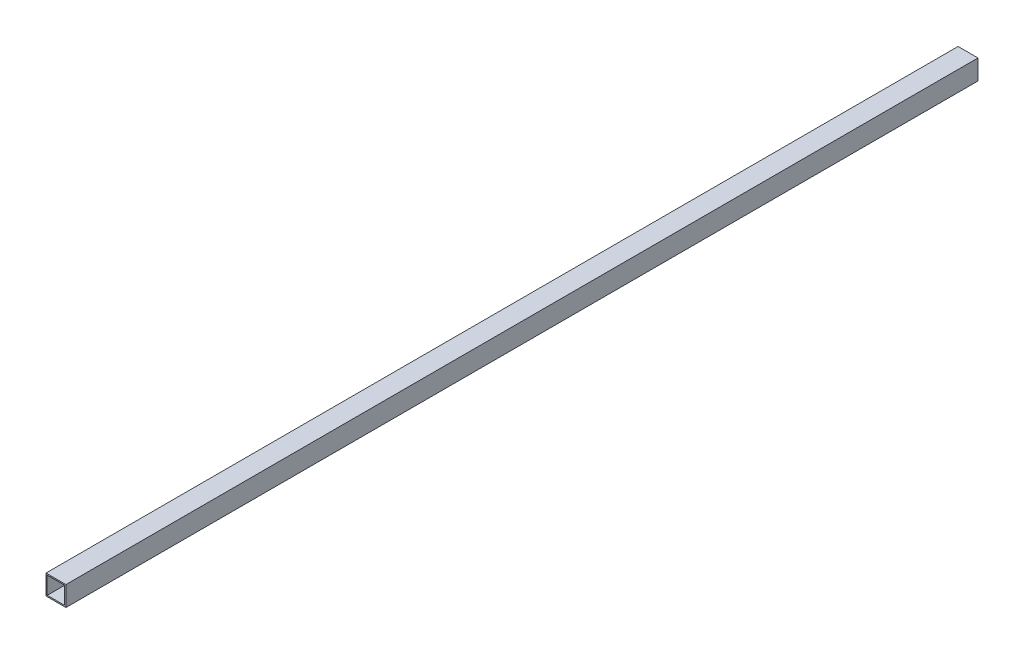
ISO-10303-21;
HEADER;
FILE_DESCRIPTION(('STEP AP214'),'2;1');
FILE_NAME('part.step','',(''),(''),'','','');
FILE_SCHEMA(('AUTOMOTIVE_DESIGN { 1 0 10303 214 1 1 1 1 }'));
ENDSEC;
DATA;
#1=APPLICATION_CONTEXT('core data for automotive mechanical design processes');
#2=APPLICATION_PROTOCOL_DEFINITION('international standard','automotive_design',2000,#1);
#3=PRODUCT_CONTEXT('',#1,'mechanical');
#4=PRODUCT('Part','Part','',(#3));
#5=PRODUCT_RELATED_PRODUCT_CATEGORY('part','',(#4));
#6=PRODUCT_DEFINITION_FORMATION('','',#4);
#7=PRODUCT_DEFINITION_CONTEXT('part definition',#1,'design');
#8=PRODUCT_DEFINITION('design','',#6,#7);
#9=PRODUCT_DEFINITION_SHAPE('','',#8);
#10=(LENGTH_UNIT() NAMED_UNIT(*) SI_UNIT(.MILLI.,.METRE.));
#11=(NAMED_UNIT(*) PLANE_ANGLE_UNIT() SI_UNIT($,.RADIAN.));
#12=(NAMED_UNIT(*) SI_UNIT($,.STERADIAN.) SOLID_ANGLE_UNIT());
#13=UNCERTAINTY_MEASURE_WITH_UNIT(LENGTH_MEASURE(1.E-05),#10,'distance_accuracy_value','');
#14=(GEOMETRIC_REPRESENTATION_CONTEXT(3) GLOBAL_UNCERTAINTY_ASSIGNED_CONTEXT((#13)) GLOBAL_UNIT_ASSIGNED_CONTEXT((#10,
#11,#12)) REPRESENTATION_CONTEXT('',''));
#15=CARTESIAN_POINT('',(0.,0.,0.));
#16=DIRECTION('',(0.,0.,1.));
#17=DIRECTION('',(1.,0.,0.));
#18=AXIS2_PLACEMENT_3D('',#15,#16,#17);
#19=CARTESIAN_POINT('',(25.4,25.4,-2324.1));
#20=DIRECTION('',(1.,0.,0.));
#21=DIRECTION('',(0.,0.,-1.));
#22=AXIS2_PLACEMENT_3D('',#19,#20,#21);
#23=PLANE('',#22);
#24=DIRECTION('',(0.,1.,0.));
#25=VECTOR('',#24,1.);
#26=CARTESIAN_POINT('',(25.4,25.4,0.));
#27=LINE('',#26,#25);
#28=CARTESIAN_POINT('',(25.4,-25.4,0.));
#29=VERTEX_POINT('',#28);
#30=CARTESIAN_POINT('',(25.4,25.4,0.));
#31=VERTEX_POINT('',#30);
#32=EDGE_CURVE('E148',#29,#31,#27,.T.);
#33=ORIENTED_EDGE('',*,*,#32,.F.);
#34=DIRECTION('',(0.,0.,1.));
#35=VECTOR('',#34,1.);
#36=CARTESIAN_POINT('',(25.4,-25.4,-2324.1));
#37=LINE('',#36,#35);
#38=CARTESIAN_POINT('',(25.4,-25.4,-2324.1));
#39=VERTEX_POINT('',#38);
#40=EDGE_CURVE('E11',#39,#29,#37,.T.);
#41=ORIENTED_EDGE('',*,*,#40,.F.);
#42=DIRECTION('',(0.,1.,0.));
#43=VECTOR('',#42,1.);
#44=CARTESIAN_POINT('',(25.4,25.4,-2324.1));
#45=LINE('',#44,#43);
#46=CARTESIAN_POINT('',(25.4,25.4,-2324.1));
#47=VERTEX_POINT('',#46);
#48=EDGE_CURVE('E154',#39,#47,#45,.T.);
#49=ORIENTED_EDGE('',*,*,#48,.T.);
#50=DIRECTION('',(0.,0.,1.));
#51=VECTOR('',#50,1.);
#52=CARTESIAN_POINT('',(25.4,25.4,-2324.1));
#53=LINE('',#52,#51);
#54=EDGE_CURVE('E42',#47,#31,#53,.T.);
#55=ORIENTED_EDGE('',*,*,#54,.T.);
#56=EDGE_LOOP('',(#33,#41,#49,#55));
#57=FACE_BOUND('',#56,.T.);
#58=ADVANCED_FACE('F39',(#57),#23,.T.);
#59=CARTESIAN_POINT('',(-25.4,-25.4,-2324.1));
#60=DIRECTION('',(0.,-1.,0.));
#61=DIRECTION('',(0.,0.,-1.));
#62=AXIS2_PLACEMENT_3D('',#59,#60,#61);
#63=PLANE('',#62);
#64=DIRECTION('',(1.,0.,0.));
#65=VECTOR('',#64,1.);
#66=CARTESIAN_POINT('',(-25.4,-25.4,0.));
#67=LINE('',#66,#65);
#68=CARTESIAN_POINT('',(-25.4,-25.4,0.));
#69=VERTEX_POINT('',#68);
#70=EDGE_CURVE('E159',#69,#29,#67,.T.);
#71=ORIENTED_EDGE('',*,*,#70,.F.);
#72=DIRECTION('',(0.,0.,1.));
#73=VECTOR('',#72,1.);
#74=CARTESIAN_POINT('',(-25.4,-25.4,-2324.1));
#75=LINE('',#74,#73);
#76=CARTESIAN_POINT('',(-25.4,-25.4,-2324.1));
#77=VERTEX_POINT('',#76);
#78=EDGE_CURVE('E48',#77,#69,#75,.T.);
#79=ORIENTED_EDGE('',*,*,#78,.F.);
#80=DIRECTION('',(1.,0.,0.));
#81=VECTOR('',#80,1.);
#82=CARTESIAN_POINT('',(-25.4,-25.4,-2324.1));
#83=LINE('',#82,#81);
#84=EDGE_CURVE('E167',#77,#39,#83,.T.);
#85=ORIENTED_EDGE('',*,*,#84,.T.);
#86=ORIENTED_EDGE('',*,*,#40,.T.);
#87=EDGE_LOOP('',(#71,#79,#85,#86));
#88=FACE_BOUND('',#87,.T.);
#89=ADVANCED_FACE('F201',(#88),#63,.T.);
#90=CARTESIAN_POINT('',(-25.4,25.4,-2324.1));
#91=DIRECTION('',(-1.,0.,0.));
#92=DIRECTION('',(0.,0.,1.));
#93=AXIS2_PLACEMENT_3D('',#90,#91,#92);
#94=PLANE('',#93);
#95=DIRECTION('',(0.,-1.,0.));
#96=VECTOR('',#95,1.);
#97=CARTESIAN_POINT('',(-25.4,25.4,0.));
#98=LINE('',#97,#96);
#99=CARTESIAN_POINT('',(-25.4,25.4,0.));
#100=VERTEX_POINT('',#99);
#101=EDGE_CURVE('E178',#100,#69,#98,.T.);
#102=ORIENTED_EDGE('',*,*,#101,.F.);
#103=DIRECTION('',(0.,0.,1.));
#104=VECTOR('',#103,1.);
#105=CARTESIAN_POINT('',(-25.4,25.4,-2324.1));
#106=LINE('',#105,#104);
#107=CARTESIAN_POINT('',(-25.4,25.4,-2324.1));
#108=VERTEX_POINT('',#107);
#109=EDGE_CURVE('E186',#108,#100,#106,.T.);
#110=ORIENTED_EDGE('',*,*,#109,.F.);
#111=DIRECTION('',(0.,-1.,0.));
#112=VECTOR('',#111,1.);
#113=CARTESIAN_POINT('',(-25.4,25.4,-2324.1));
#114=LINE('',#113,#112);
#115=EDGE_CURVE('E163',#108,#77,#114,.T.);
#116=ORIENTED_EDGE('',*,*,#115,.T.);
#117=ORIENTED_EDGE('',*,*,#78,.T.);
#118=EDGE_LOOP('',(#102,#110,#116,#117));
#119=FACE_BOUND('',#118,.T.);
#120=ADVANCED_FACE('F205',(#119),#94,.T.);
#121=CARTESIAN_POINT('',(-25.4,25.4,-2324.1));
#122=DIRECTION('',(0.,1.,0.));
#123=DIRECTION('',(0.,0.,1.));
#124=AXIS2_PLACEMENT_3D('',#121,#122,#123);
#125=PLANE('',#124);
#126=DIRECTION('',(-1.,0.,0.));
#127=VECTOR('',#126,1.);
#128=CARTESIAN_POINT('',(-25.4,25.4,0.));
#129=LINE('',#128,#127);
#130=EDGE_CURVE('E174',#31,#100,#129,.T.);
#131=ORIENTED_EDGE('',*,*,#130,.F.);
#132=ORIENTED_EDGE('',*,*,#54,.F.);
#133=DIRECTION('',(-1.,0.,0.));
#134=VECTOR('',#133,1.);
#135=CARTESIAN_POINT('',(-25.4,25.4,-2324.1));
#136=LINE('',#135,#134);
#137=EDGE_CURVE('E158',#47,#108,#136,.T.);
#138=ORIENTED_EDGE('',*,*,#137,.T.);
#139=ORIENTED_EDGE('',*,*,#109,.T.);
#140=EDGE_LOOP('',(#131,#132,#138,#139));
#141=FACE_BOUND('',#140,.T.);
#142=ADVANCED_FACE('F196',(#141),#125,.T.);
#143=CARTESIAN_POINT('',(0.,0.,-2324.1));
#144=DIRECTION('',(0.,0.,1.));
#145=DIRECTION('',(1.,0.,0.));
#146=AXIS2_PLACEMENT_3D('',#143,#144,#145);
#147=PLANE('',#146);
#148=DIRECTION('',(1.,0.,0.));
#149=VECTOR('',#148,1.);
#150=CARTESIAN_POINT('',(-22.225,-22.225,-2324.1));
#151=LINE('',#150,#149);
#152=CARTESIAN_POINT('',(-22.225,-22.225,-2324.1));
#153=VERTEX_POINT('',#152);
#154=CARTESIAN_POINT('',(22.225,-22.225,-2324.1));
#155=VERTEX_POINT('',#154);
#156=EDGE_CURVE('E114',#153,#155,#151,.T.);
#157=ORIENTED_EDGE('',*,*,#156,.T.);
#158=DIRECTION('',(0.,1.,0.));
#159=VECTOR('',#158,1.);
#160=CARTESIAN_POINT('',(22.225,22.225,-2324.1));
#161=LINE('',#160,#159);
#162=CARTESIAN_POINT('',(22.225,22.225,-2324.1));
#163=VERTEX_POINT('',#162);
#164=EDGE_CURVE('E107',#155,#163,#161,.T.);
#165=ORIENTED_EDGE('',*,*,#164,.T.);
#166=DIRECTION('',(-1.,0.,0.));
#167=VECTOR('',#166,1.);
#168=CARTESIAN_POINT('',(-22.225,22.225,-2324.1));
#169=LINE('',#168,#167);
#170=CARTESIAN_POINT('',(-22.225,22.225,-2324.1));
#171=VERTEX_POINT('',#170);
#172=EDGE_CURVE('E117',#163,#171,#169,.T.);
#173=ORIENTED_EDGE('',*,*,#172,.T.);
#174=DIRECTION('',(0.,-1.,0.));
#175=VECTOR('',#174,1.);
#176=CARTESIAN_POINT('',(-22.225,22.225,-2324.1));
#177=LINE('',#176,#175);
#178=EDGE_CURVE('E56',#171,#153,#177,.T.);
#179=ORIENTED_EDGE('',*,*,#178,.T.);
#180=EDGE_LOOP('',(#157,#165,#173,#179));
#181=FACE_BOUND('',#180,.T.);
#182=ORIENTED_EDGE('',*,*,#48,.F.);
#183=ORIENTED_EDGE('',*,*,#84,.F.);
#184=ORIENTED_EDGE('',*,*,#115,.F.);
#185=ORIENTED_EDGE('',*,*,#137,.F.);
#186=EDGE_LOOP('',(#182,#183,#184,#185));
#187=FACE_BOUND('',#186,.T.);
#188=ADVANCED_FACE('F122',(#181,#187),#147,.F.);
#189=CARTESIAN_POINT('',(0.,0.,0.));
#190=DIRECTION('',(0.,0.,1.));
#191=DIRECTION('',(1.,0.,0.));
#192=AXIS2_PLACEMENT_3D('',#189,#190,#191);
#193=PLANE('',#192);
#194=DIRECTION('',(0.,1.,0.));
#195=VECTOR('',#194,1.);
#196=CARTESIAN_POINT('',(22.225,22.225,0.));
#197=LINE('',#196,#195);
#198=CARTESIAN_POINT('',(22.225,-22.225,0.));
#199=VERTEX_POINT('',#198);
#200=CARTESIAN_POINT('',(22.225,22.225,0.));
#201=VERTEX_POINT('',#200);
#202=EDGE_CURVE('E64',#199,#201,#197,.T.);
#203=ORIENTED_EDGE('',*,*,#202,.F.);
#204=DIRECTION('',(1.,0.,0.));
#205=VECTOR('',#204,1.);
#206=CARTESIAN_POINT('',(-22.225,-22.225,0.));
#207=LINE('',#206,#205);
#208=CARTESIAN_POINT('',(-22.225,-22.225,0.));
#209=VERTEX_POINT('',#208);
#210=EDGE_CURVE('E126',#209,#199,#207,.T.);
#211=ORIENTED_EDGE('',*,*,#210,.F.);
#212=DIRECTION('',(0.,-1.,0.));
#213=VECTOR('',#212,1.);
#214=CARTESIAN_POINT('',(-22.225,22.225,0.));
#215=LINE('',#214,#213);
#216=CARTESIAN_POINT('',(-22.225,22.225,0.));
#217=VERTEX_POINT('',#216);
#218=EDGE_CURVE('E130',#217,#209,#215,.T.);
#219=ORIENTED_EDGE('',*,*,#218,.F.);
#220=DIRECTION('',(-1.,0.,0.));
#221=VECTOR('',#220,1.);
#222=CARTESIAN_POINT('',(-22.225,22.225,0.));
#223=LINE('',#222,#221);
#224=EDGE_CURVE('E139',#201,#217,#223,.T.);
#225=ORIENTED_EDGE('',*,*,#224,.F.);
#226=EDGE_LOOP('',(#203,#211,#219,#225));
#227=FACE_BOUND('',#226,.T.);
#228=ORIENTED_EDGE('',*,*,#32,.T.);
#229=ORIENTED_EDGE('',*,*,#130,.T.);
#230=ORIENTED_EDGE('',*,*,#101,.T.);
#231=ORIENTED_EDGE('',*,*,#70,.T.);
#232=EDGE_LOOP('',(#228,#229,#230,#231));
#233=FACE_BOUND('',#232,.T.);
#234=ADVANCED_FACE('F198',(#227,#233),#193,.T.);
#235=CARTESIAN_POINT('',(22.225,22.225,-2324.1));
#236=DIRECTION('',(1.,0.,0.));
#237=DIRECTION('',(0.,0.,-1.));
#238=AXIS2_PLACEMENT_3D('',#235,#236,#237);
#239=PLANE('',#238);
#240=ORIENTED_EDGE('',*,*,#202,.T.);
#241=DIRECTION('',(0.,0.,1.));
#242=VECTOR('',#241,1.);
#243=CARTESIAN_POINT('',(22.225,22.225,-2324.1));
#244=LINE('',#243,#242);
#245=EDGE_CURVE('E103',#163,#201,#244,.T.);
#246=ORIENTED_EDGE('',*,*,#245,.F.);
#247=ORIENTED_EDGE('',*,*,#164,.F.);
#248=DIRECTION('',(0.,0.,1.));
#249=VECTOR('',#248,1.);
#250=CARTESIAN_POINT('',(22.225,-22.225,-2324.1));
#251=LINE('',#250,#249);
#252=EDGE_CURVE('E145',#155,#199,#251,.T.);
#253=ORIENTED_EDGE('',*,*,#252,.T.);
#254=EDGE_LOOP('',(#240,#246,#247,#253));
#255=FACE_BOUND('',#254,.T.);
#256=ADVANCED_FACE('F105',(#255),#239,.F.);
#257=CARTESIAN_POINT('',(-22.225,-22.225,-2324.1));
#258=DIRECTION('',(0.,-1.,0.));
#259=DIRECTION('',(0.,0.,-1.));
#260=AXIS2_PLACEMENT_3D('',#257,#258,#259);
#261=PLANE('',#260);
#262=ORIENTED_EDGE('',*,*,#210,.T.);
#263=ORIENTED_EDGE('',*,*,#252,.F.);
#264=ORIENTED_EDGE('',*,*,#156,.F.);
#265=DIRECTION('',(0.,0.,1.));
#266=VECTOR('',#265,1.);
#267=CARTESIAN_POINT('',(-22.225,-22.225,-2324.1));
#268=LINE('',#267,#266);
#269=EDGE_CURVE('E149',#153,#209,#268,.T.);
#270=ORIENTED_EDGE('',*,*,#269,.T.);
#271=EDGE_LOOP('',(#262,#263,#264,#270));
#272=FACE_BOUND('',#271,.T.);
#273=ADVANCED_FACE('F256',(#272),#261,.F.);
#274=CARTESIAN_POINT('',(-22.225,22.225,-2324.1));
#275=DIRECTION('',(-1.,0.,0.));
#276=DIRECTION('',(0.,0.,1.));
#277=AXIS2_PLACEMENT_3D('',#274,#275,#276);
#278=PLANE('',#277);
#279=ORIENTED_EDGE('',*,*,#218,.T.);
#280=ORIENTED_EDGE('',*,*,#269,.F.);
#281=ORIENTED_EDGE('',*,*,#178,.F.);
#282=DIRECTION('',(0.,0.,1.));
#283=VECTOR('',#282,1.);
#284=CARTESIAN_POINT('',(-22.225,22.225,-2324.1));
#285=LINE('',#284,#283);
#286=EDGE_CURVE('E113',#171,#217,#285,.T.);
#287=ORIENTED_EDGE('',*,*,#286,.T.);
#288=EDGE_LOOP('',(#279,#280,#281,#287));
#289=FACE_BOUND('',#288,.T.);
#290=ADVANCED_FACE('F265',(#289),#278,.F.);
#291=CARTESIAN_POINT('',(-22.225,22.225,-2324.1));
#292=DIRECTION('',(0.,1.,0.));
#293=DIRECTION('',(0.,0.,1.));
#294=AXIS2_PLACEMENT_3D('',#291,#292,#293);
#295=PLANE('',#294);
#296=ORIENTED_EDGE('',*,*,#224,.T.);
#297=ORIENTED_EDGE('',*,*,#286,.F.);
#298=ORIENTED_EDGE('',*,*,#172,.F.);
#299=ORIENTED_EDGE('',*,*,#245,.T.);
#300=EDGE_LOOP('',(#296,#297,#298,#299));
#301=FACE_BOUND('',#300,.T.);
#302=ADVANCED_FACE('F118',(#301),#295,.F.);
#303=CLOSED_SHELL('',(#58,#89,#120,#142,#188,#234,#256,#273,#290,#302));
#304=MANIFOLD_SOLID_BREP('B2',#303);
#305=ADVANCED_BREP_SHAPE_REPRESENTATION('',(#18,#304),#14);
#306=SHAPE_DEFINITION_REPRESENTATION(#9,#305);
ENDSEC;
END-ISO-10303-21;
